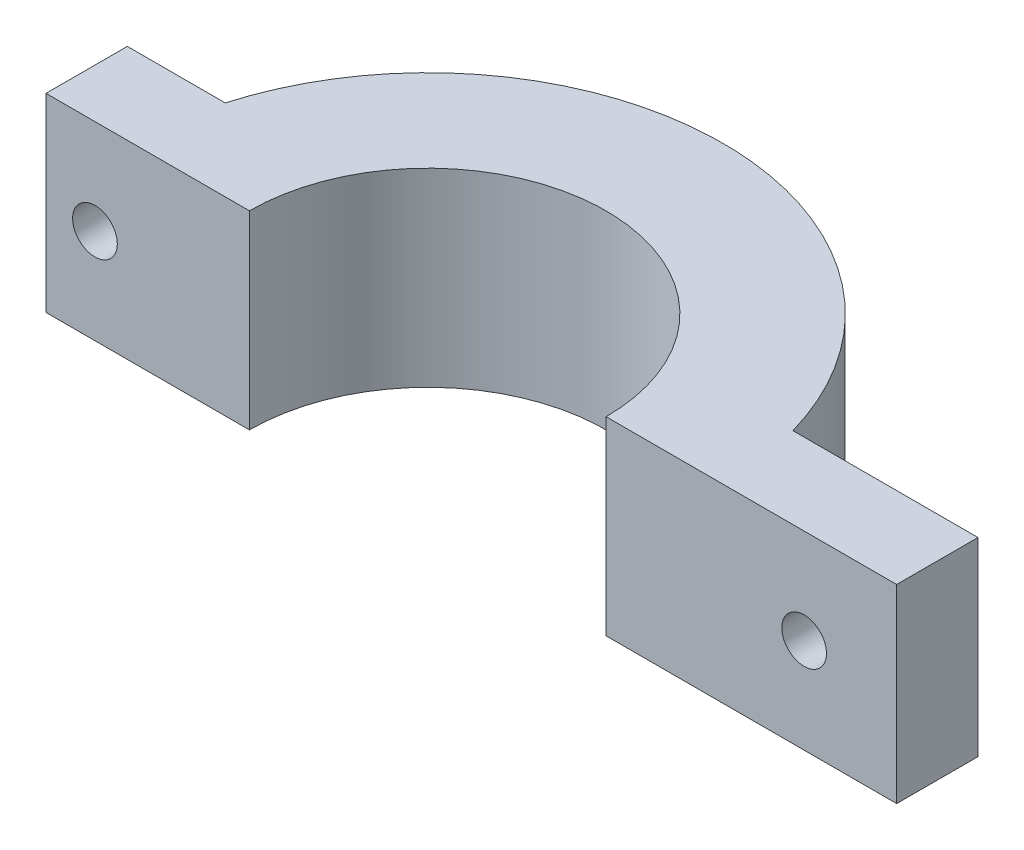
ISO-10303-21;
HEADER;
FILE_DESCRIPTION(('STEP AP214'),'2;1');
FILE_NAME('part.step','',(''),(''),'','','');
FILE_SCHEMA(('AUTOMOTIVE_DESIGN { 1 0 10303 214 1 1 1 1 }'));
ENDSEC;
DATA;
#1=APPLICATION_CONTEXT('core data for automotive mechanical design processes');
#2=APPLICATION_PROTOCOL_DEFINITION('international standard','automotive_design',2000,#1);
#3=PRODUCT_CONTEXT('',#1,'mechanical');
#4=PRODUCT('Part','Part','',(#3));
#5=PRODUCT_RELATED_PRODUCT_CATEGORY('part','',(#4));
#6=PRODUCT_DEFINITION_FORMATION('','',#4);
#7=PRODUCT_DEFINITION_CONTEXT('part definition',#1,'design');
#8=PRODUCT_DEFINITION('design','',#6,#7);
#9=PRODUCT_DEFINITION_SHAPE('','',#8);
#10=(LENGTH_UNIT() NAMED_UNIT(*) SI_UNIT(.MILLI.,.METRE.));
#11=(NAMED_UNIT(*) PLANE_ANGLE_UNIT() SI_UNIT($,.RADIAN.));
#12=(NAMED_UNIT(*) SI_UNIT($,.STERADIAN.) SOLID_ANGLE_UNIT());
#13=UNCERTAINTY_MEASURE_WITH_UNIT(LENGTH_MEASURE(1.E-05),#10,'distance_accuracy_value','');
#14=(GEOMETRIC_REPRESENTATION_CONTEXT(3) GLOBAL_UNCERTAINTY_ASSIGNED_CONTEXT((#13)) GLOBAL_UNIT_ASSIGNED_CONTEXT((#10,
#11,#12)) REPRESENTATION_CONTEXT('',''));
#15=CARTESIAN_POINT('',(0.,0.,0.));
#16=DIRECTION('',(0.,0.,1.));
#17=DIRECTION('',(1.,0.,0.));
#18=AXIS2_PLACEMENT_3D('',#15,#16,#17);
#19=CARTESIAN_POINT('',(0.,-74.82,0.));
#20=DIRECTION('',(0.,-1.,0.));
#21=DIRECTION('',(0.,0.,-1.));
#22=AXIS2_PLACEMENT_3D('',#19,#20,#21);
#23=PLANE('',#22);
#24=DIRECTION('',(0.,0.,-1.));
#25=VECTOR('',#24,1.);
#26=CARTESIAN_POINT('',(12.75,-74.82,0.));
#27=LINE('',#26,#25);
#28=CARTESIAN_POINT('',(12.75,-74.82,0.));
#29=VERTEX_POINT('',#28);
#30=CARTESIAN_POINT('',(12.75,-74.82,-6.955));
#31=VERTEX_POINT('',#30);
#32=EDGE_CURVE('E132',#29,#31,#27,.T.);
#33=ORIENTED_EDGE('',*,*,#32,.F.);
#34=DIRECTION('',(-1.,0.,0.));
#35=VECTOR('',#34,1.);
#36=CARTESIAN_POINT('',(0.,-74.82,0.));
#37=LINE('',#36,#35);
#38=CARTESIAN_POINT('',(-12.101479578733,-74.82,0.));
#39=VERTEX_POINT('',#38);
#40=EDGE_CURVE('E142',#29,#39,#37,.T.);
#41=ORIENTED_EDGE('',*,*,#40,.T.);
#42=CARTESIAN_POINT('',(-27.351479578733,-74.82,0.));
#43=DIRECTION('',(0.,-1.,0.));
#44=DIRECTION('',(0.,0.,-1.));
#45=AXIS2_PLACEMENT_3D('',#42,#43,#44);
#46=CIRCLE('',#45,15.25);
#47=CARTESIAN_POINT('',(-42.601479578733,-74.82,0.));
#48=VERTEX_POINT('',#47);
#49=EDGE_CURVE('E188',#48,#39,#46,.T.);
#50=ORIENTED_EDGE('',*,*,#49,.F.);
#51=CARTESIAN_POINT('',(-60.,-74.82,0.));
#52=VERTEX_POINT('',#51);
#53=EDGE_CURVE('E152',#48,#52,#37,.T.);
#54=ORIENTED_EDGE('',*,*,#53,.T.);
#55=DIRECTION('',(0.,0.,-1.));
#56=VECTOR('',#55,1.);
#57=CARTESIAN_POINT('',(-60.,-74.82,-6.955));
#58=LINE('',#57,#56);
#59=CARTESIAN_POINT('',(-60.,-74.82,-6.955));
#60=VERTEX_POINT('',#59);
#61=EDGE_CURVE('E199',#52,#60,#58,.T.);
#62=ORIENTED_EDGE('',*,*,#61,.T.);
#63=DIRECTION('',(-1.,0.,0.));
#64=VECTOR('',#63,1.);
#65=CARTESIAN_POINT('',(-50.,-74.82,-6.955));
#66=LINE('',#65,#64);
#67=CARTESIAN_POINT('',(-51.6247256533725,-74.82,-6.955));
#68=VERTEX_POINT('',#67);
#69=EDGE_CURVE('E196',#68,#60,#66,.T.);
#70=ORIENTED_EDGE('',*,*,#69,.F.);
#71=CARTESIAN_POINT('',(-27.351479578733,-74.82,0.));
#72=DIRECTION('',(0.,-1.,0.));
#73=DIRECTION('',(1.,0.,0.));
#74=AXIS2_PLACEMENT_3D('',#71,#72,#73);
#75=CIRCLE('',#74,25.25);
#76=CARTESIAN_POINT('',(-3.07823350409353,-74.82,-6.955));
#77=VERTEX_POINT('',#76);
#78=EDGE_CURVE('E184',#68,#77,#75,.T.);
#79=ORIENTED_EDGE('',*,*,#78,.T.);
#80=DIRECTION('',(1.,0.,0.));
#81=VECTOR('',#80,1.);
#82=CARTESIAN_POINT('',(12.75,-74.82,-6.955));
#83=LINE('',#82,#81);
#84=EDGE_CURVE('E72',#77,#31,#83,.T.);
#85=ORIENTED_EDGE('',*,*,#84,.T.);
#86=EDGE_LOOP('',(#33,#41,#50,#54,#62,#70,#79,#85));
#87=FACE_BOUND('',#86,.T.);
#88=ADVANCED_FACE('F63',(#87),#23,.T.);
#89=CARTESIAN_POINT('',(-3.25,-58.59,-6.95500000000001));
#90=DIRECTION('',(0.,-1.,0.));
#91=DIRECTION('',(0.,0.,-1.));
#92=AXIS2_PLACEMENT_3D('',#89,#90,#91);
#93=PLANE('',#92);
#94=DIRECTION('',(-1.,0.,0.));
#95=VECTOR('',#94,1.);
#96=CARTESIAN_POINT('',(-3.25,-58.59,0.));
#97=LINE('',#96,#95);
#98=CARTESIAN_POINT('',(12.75,-58.59,0.));
#99=VERTEX_POINT('',#98);
#100=CARTESIAN_POINT('',(-12.101479578733,-58.59,0.));
#101=VERTEX_POINT('',#100);
#102=EDGE_CURVE('E79',#99,#101,#97,.T.);
#103=ORIENTED_EDGE('',*,*,#102,.F.);
#104=DIRECTION('',(0.,0.,-1.));
#105=VECTOR('',#104,1.);
#106=CARTESIAN_POINT('',(12.75,-58.59,-6.955));
#107=LINE('',#106,#105);
#108=CARTESIAN_POINT('',(12.75,-58.59,-6.955));
#109=VERTEX_POINT('',#108);
#110=EDGE_CURVE('E135',#99,#109,#107,.T.);
#111=ORIENTED_EDGE('',*,*,#110,.T.);
#112=DIRECTION('',(1.,0.,0.));
#113=VECTOR('',#112,1.);
#114=CARTESIAN_POINT('',(-3.25,-58.59,-6.95500000000001));
#115=LINE('',#114,#113);
#116=CARTESIAN_POINT('',(-3.07823350409353,-58.59,-6.95500000000001));
#117=VERTEX_POINT('',#116);
#118=EDGE_CURVE('E173',#117,#109,#115,.T.);
#119=ORIENTED_EDGE('',*,*,#118,.F.);
#120=CARTESIAN_POINT('',(-27.351479578733,-58.59,0.));
#121=DIRECTION('',(0.,-1.,0.));
#122=DIRECTION('',(1.,0.,0.));
#123=AXIS2_PLACEMENT_3D('',#120,#121,#122);
#124=CIRCLE('',#123,25.25);
#125=CARTESIAN_POINT('',(-51.6247256533725,-58.59,-6.955));
#126=VERTEX_POINT('',#125);
#127=EDGE_CURVE('E183',#126,#117,#124,.T.);
#128=ORIENTED_EDGE('',*,*,#127,.F.);
#129=DIRECTION('',(-1.,0.,0.));
#130=VECTOR('',#129,1.);
#131=CARTESIAN_POINT('',(-50.,-58.59,-6.955));
#132=LINE('',#131,#130);
#133=CARTESIAN_POINT('',(-60.,-58.59,-6.955));
#134=VERTEX_POINT('',#133);
#135=EDGE_CURVE('E194',#126,#134,#132,.T.);
#136=ORIENTED_EDGE('',*,*,#135,.T.);
#137=DIRECTION('',(0.,0.,1.));
#138=VECTOR('',#137,1.);
#139=CARTESIAN_POINT('',(-60.,-58.59,-6.955));
#140=LINE('',#139,#138);
#141=CARTESIAN_POINT('',(-60.,-58.59,0.));
#142=VERTEX_POINT('',#141);
#143=EDGE_CURVE('E201',#134,#142,#140,.T.);
#144=ORIENTED_EDGE('',*,*,#143,.T.);
#145=CARTESIAN_POINT('',(-42.601479578733,-58.59,0.));
#146=VERTEX_POINT('',#145);
#147=EDGE_CURVE('E87',#146,#142,#97,.T.);
#148=ORIENTED_EDGE('',*,*,#147,.F.);
#149=CARTESIAN_POINT('',(-27.351479578733,-58.59,0.));
#150=DIRECTION('',(0.,-1.,0.));
#151=DIRECTION('',(0.,0.,-1.));
#152=AXIS2_PLACEMENT_3D('',#149,#150,#151);
#153=CIRCLE('',#152,15.25);
#154=EDGE_CURVE('E186',#146,#101,#153,.T.);
#155=ORIENTED_EDGE('',*,*,#154,.T.);
#156=EDGE_LOOP('',(#103,#111,#119,#128,#136,#144,#148,#155));
#157=FACE_BOUND('',#156,.T.);
#158=ADVANCED_FACE('F171',(#157),#93,.F.);
#159=CARTESIAN_POINT('',(-27.351479578733,-58.59,0.));
#160=DIRECTION('',(0.,-1.,0.));
#161=DIRECTION('',(0.,0.,-1.));
#162=AXIS2_PLACEMENT_3D('',#159,#160,#161);
#163=CYLINDRICAL_SURFACE('',#162,15.25);
#164=DIRECTION('',(0.,-1.,0.));
#165=VECTOR('',#164,1.);
#166=CARTESIAN_POINT('',(-42.601479578733,-58.59,0.));
#167=LINE('',#166,#165);
#168=EDGE_CURVE('E150',#48,#146,#167,.F.);
#169=ORIENTED_EDGE('',*,*,#168,.F.);
#170=ORIENTED_EDGE('',*,*,#49,.T.);
#171=DIRECTION('',(0.,-1.,0.));
#172=VECTOR('',#171,1.);
#173=CARTESIAN_POINT('',(-12.101479578733,-58.59,0.));
#174=LINE('',#173,#172);
#175=EDGE_CURVE('E148',#101,#39,#174,.T.);
#176=ORIENTED_EDGE('',*,*,#175,.F.);
#177=ORIENTED_EDGE('',*,*,#154,.F.);
#178=EDGE_LOOP('',(#169,#170,#176,#177));
#179=FACE_BOUND('',#178,.T.);
#180=ADVANCED_FACE('F234',(#179),#163,.F.);
#181=CARTESIAN_POINT('',(4.83588324795129,-66.7050000000066,25.25));
#182=DIRECTION('',(0.,0.,-1.));
#183=DIRECTION('',(-1.,0.,0.));
#184=AXIS2_PLACEMENT_3D('',#181,#182,#183);
#185=CYLINDRICAL_SURFACE('',#184,1.91);
#186=CARTESIAN_POINT('',(4.83588324795129,-66.7050000000066,-6.955));
#187=DIRECTION('',(0.,0.,-1.));
#188=DIRECTION('',(-1.,0.,0.));
#189=AXIS2_PLACEMENT_3D('',#186,#187,#188);
#190=CIRCLE('',#189,1.91);
#191=CARTESIAN_POINT('',(2.92588324795129,-66.7050000000066,-6.955));
#192=VERTEX_POINT('',#191);
#193=EDGE_CURVE('E190',#192,#192,#190,.T.);
#194=ORIENTED_EDGE('',*,*,#193,.T.);
#195=EDGE_LOOP('',(#194));
#196=FACE_BOUND('',#195,.T.);
#197=CARTESIAN_POINT('',(4.83588324795129,-66.7050000000066,0.));
#198=DIRECTION('',(0.,0.,1.));
#199=DIRECTION('',(1.,0.,0.));
#200=AXIS2_PLACEMENT_3D('',#197,#198,#199);
#201=CIRCLE('',#200,1.91);
#202=CARTESIAN_POINT('',(6.74588324795129,-66.7050000000066,0.));
#203=VERTEX_POINT('',#202);
#204=EDGE_CURVE('E163',#203,#203,#201,.F.);
#205=ORIENTED_EDGE('',*,*,#204,.F.);
#206=EDGE_LOOP('',(#205));
#207=FACE_BOUND('',#206,.T.);
#208=ADVANCED_FACE('F238',(#196,#207),#185,.F.);
#209=CARTESIAN_POINT('',(-60.,0.,0.));
#210=DIRECTION('',(-1.,0.,0.));
#211=DIRECTION('',(0.,0.,1.));
#212=AXIS2_PLACEMENT_3D('',#209,#210,#211);
#213=PLANE('',#212);
#214=ORIENTED_EDGE('',*,*,#61,.F.);
#215=DIRECTION('',(0.,-1.,0.));
#216=VECTOR('',#215,1.);
#217=CARTESIAN_POINT('',(-60.,24.41,0.));
#218=LINE('',#217,#216);
#219=EDGE_CURVE('E144',#142,#52,#218,.T.);
#220=ORIENTED_EDGE('',*,*,#219,.F.);
#221=ORIENTED_EDGE('',*,*,#143,.F.);
#222=DIRECTION('',(0.,1.,0.));
#223=VECTOR('',#222,1.);
#224=CARTESIAN_POINT('',(-60.,-58.59,-6.955));
#225=LINE('',#224,#223);
#226=EDGE_CURVE('E159',#60,#134,#225,.T.);
#227=ORIENTED_EDGE('',*,*,#226,.F.);
#228=EDGE_LOOP('',(#214,#220,#221,#227));
#229=FACE_BOUND('',#228,.T.);
#230=ADVANCED_FACE('F211',(#229),#213,.T.);
#231=CARTESIAN_POINT('',(-55.8123628266859,-66.7050000000066,25.25));
#232=DIRECTION('',(0.,0.,-1.));
#233=DIRECTION('',(-1.,0.,0.));
#234=AXIS2_PLACEMENT_3D('',#231,#232,#233);
#235=CYLINDRICAL_SURFACE('',#234,1.91);
#236=CARTESIAN_POINT('',(-55.8123628266859,-66.7050000000066,-6.955));
#237=DIRECTION('',(0.,0.,-1.));
#238=DIRECTION('',(-1.,0.,0.));
#239=AXIS2_PLACEMENT_3D('',#236,#237,#238);
#240=CIRCLE('',#239,1.91);
#241=CARTESIAN_POINT('',(-57.7223628266859,-66.7050000000066,-6.955));
#242=VERTEX_POINT('',#241);
#243=EDGE_CURVE('E156',#242,#242,#240,.T.);
#244=ORIENTED_EDGE('',*,*,#243,.T.);
#245=EDGE_LOOP('',(#244));
#246=FACE_BOUND('',#245,.T.);
#247=CARTESIAN_POINT('',(-55.8123628266859,-66.7050000000066,0.));
#248=DIRECTION('',(0.,0.,1.));
#249=DIRECTION('',(1.,0.,0.));
#250=AXIS2_PLACEMENT_3D('',#247,#248,#249);
#251=CIRCLE('',#250,1.91);
#252=CARTESIAN_POINT('',(-53.9023628266859,-66.7050000000066,0.));
#253=VERTEX_POINT('',#252);
#254=EDGE_CURVE('E67',#253,#253,#251,.F.);
#255=ORIENTED_EDGE('',*,*,#254,.F.);
#256=EDGE_LOOP('',(#255));
#257=FACE_BOUND('',#256,.T.);
#258=ADVANCED_FACE('F217',(#246,#257),#235,.F.);
#259=CARTESIAN_POINT('',(-27.351479578733,-58.59,0.));
#260=DIRECTION('',(0.,-1.,0.));
#261=DIRECTION('',(0.,0.,-1.));
#262=AXIS2_PLACEMENT_3D('',#259,#260,#261);
#263=CYLINDRICAL_SURFACE('',#262,25.25);
#264=ORIENTED_EDGE('',*,*,#78,.F.);
#265=DIRECTION('',(0.,-1.,0.));
#266=VECTOR('',#265,1.);
#267=CARTESIAN_POINT('',(-51.6247256533725,-58.59,-6.955));
#268=LINE('',#267,#266);
#269=EDGE_CURVE('E12',#68,#126,#268,.F.);
#270=ORIENTED_EDGE('',*,*,#269,.T.);
#271=ORIENTED_EDGE('',*,*,#127,.T.);
#272=DIRECTION('',(0.,-1.,0.));
#273=VECTOR('',#272,1.);
#274=CARTESIAN_POINT('',(-3.07823350409353,-58.59,-6.955));
#275=LINE('',#274,#273);
#276=EDGE_CURVE('E175',#77,#117,#275,.F.);
#277=ORIENTED_EDGE('',*,*,#276,.F.);
#278=EDGE_LOOP('',(#264,#270,#271,#277));
#279=FACE_BOUND('',#278,.T.);
#280=ADVANCED_FACE('F215',(#279),#263,.T.);
#281=CARTESIAN_POINT('',(12.75,-74.82,-6.955));
#282=DIRECTION('',(0.,0.,1.));
#283=DIRECTION('',(1.,0.,0.));
#284=AXIS2_PLACEMENT_3D('',#281,#282,#283);
#285=PLANE('',#284);
#286=ORIENTED_EDGE('',*,*,#193,.F.);
#287=EDGE_LOOP('',(#286));
#288=FACE_BOUND('',#287,.T.);
#289=ORIENTED_EDGE('',*,*,#118,.T.);
#290=DIRECTION('',(0.,1.,0.));
#291=VECTOR('',#290,1.);
#292=CARTESIAN_POINT('',(12.75,-93.2362928024297,-6.955));
#293=LINE('',#292,#291);
#294=EDGE_CURVE('E137',#31,#109,#293,.T.);
#295=ORIENTED_EDGE('',*,*,#294,.F.);
#296=ORIENTED_EDGE('',*,*,#84,.F.);
#297=ORIENTED_EDGE('',*,*,#276,.T.);
#298=EDGE_LOOP('',(#289,#295,#296,#297));
#299=FACE_BOUND('',#298,.T.);
#300=ADVANCED_FACE('F65',(#288,#299),#285,.F.);
#301=CARTESIAN_POINT('',(-50.,-58.59,-6.955));
#302=DIRECTION('',(0.,0.,1.));
#303=DIRECTION('',(1.,0.,0.));
#304=AXIS2_PLACEMENT_3D('',#301,#302,#303);
#305=PLANE('',#304);
#306=ORIENTED_EDGE('',*,*,#243,.F.);
#307=EDGE_LOOP('',(#306));
#308=FACE_BOUND('',#307,.T.);
#309=ORIENTED_EDGE('',*,*,#269,.F.);
#310=ORIENTED_EDGE('',*,*,#69,.T.);
#311=ORIENTED_EDGE('',*,*,#226,.T.);
#312=ORIENTED_EDGE('',*,*,#135,.F.);
#313=EDGE_LOOP('',(#309,#310,#311,#312));
#314=FACE_BOUND('',#313,.T.);
#315=ADVANCED_FACE('F208',(#308,#314),#305,.F.);
#316=CARTESIAN_POINT('',(-60.,24.41,0.));
#317=DIRECTION('',(0.,0.,1.));
#318=DIRECTION('',(1.,0.,0.));
#319=AXIS2_PLACEMENT_3D('',#316,#317,#318);
#320=PLANE('',#319);
#321=ORIENTED_EDGE('',*,*,#168,.T.);
#322=ORIENTED_EDGE('',*,*,#147,.T.);
#323=ORIENTED_EDGE('',*,*,#219,.T.);
#324=ORIENTED_EDGE('',*,*,#53,.F.);
#325=EDGE_LOOP('',(#321,#322,#323,#324));
#326=FACE_BOUND('',#325,.T.);
#327=ORIENTED_EDGE('',*,*,#254,.T.);
#328=EDGE_LOOP('',(#327));
#329=FACE_BOUND('',#328,.T.);
#330=ADVANCED_FACE('F250',(#326,#329),#320,.T.);
#331=DIRECTION('',(0.,1.,0.));
#332=VECTOR('',#331,1.);
#333=CARTESIAN_POINT('',(12.75,-93.2362928024297,0.));
#334=LINE('',#333,#332);
#335=EDGE_CURVE('E129',#29,#99,#334,.T.);
#336=ORIENTED_EDGE('',*,*,#335,.T.);
#337=ORIENTED_EDGE('',*,*,#102,.T.);
#338=ORIENTED_EDGE('',*,*,#175,.T.);
#339=ORIENTED_EDGE('',*,*,#40,.F.);
#340=EDGE_LOOP('',(#336,#337,#338,#339));
#341=FACE_BOUND('',#340,.T.);
#342=ORIENTED_EDGE('',*,*,#204,.T.);
#343=EDGE_LOOP('',(#342));
#344=FACE_BOUND('',#343,.T.);
#345=ADVANCED_FACE('F146',(#341,#344),#320,.T.);
#346=CARTESIAN_POINT('',(12.75,-93.2362928024297,0.));
#347=DIRECTION('',(-1.,0.,0.));
#348=DIRECTION('',(0.,0.,1.));
#349=AXIS2_PLACEMENT_3D('',#346,#347,#348);
#350=PLANE('',#349);
#351=ORIENTED_EDGE('',*,*,#32,.T.);
#352=ORIENTED_EDGE('',*,*,#294,.T.);
#353=ORIENTED_EDGE('',*,*,#110,.F.);
#354=ORIENTED_EDGE('',*,*,#335,.F.);
#355=EDGE_LOOP('',(#351,#352,#353,#354));
#356=FACE_BOUND('',#355,.T.);
#357=ADVANCED_FACE('F131',(#356),#350,.F.);
#358=CLOSED_SHELL('',(#88,#158,#180,#208,#230,#258,#280,#300,#315,#330,#345,#357));
#359=MANIFOLD_SOLID_BREP('B2',#358);
#360=ADVANCED_BREP_SHAPE_REPRESENTATION('',(#18,#359),#14);
#361=SHAPE_DEFINITION_REPRESENTATION(#9,#360);
ENDSEC;
END-ISO-10303-21;
